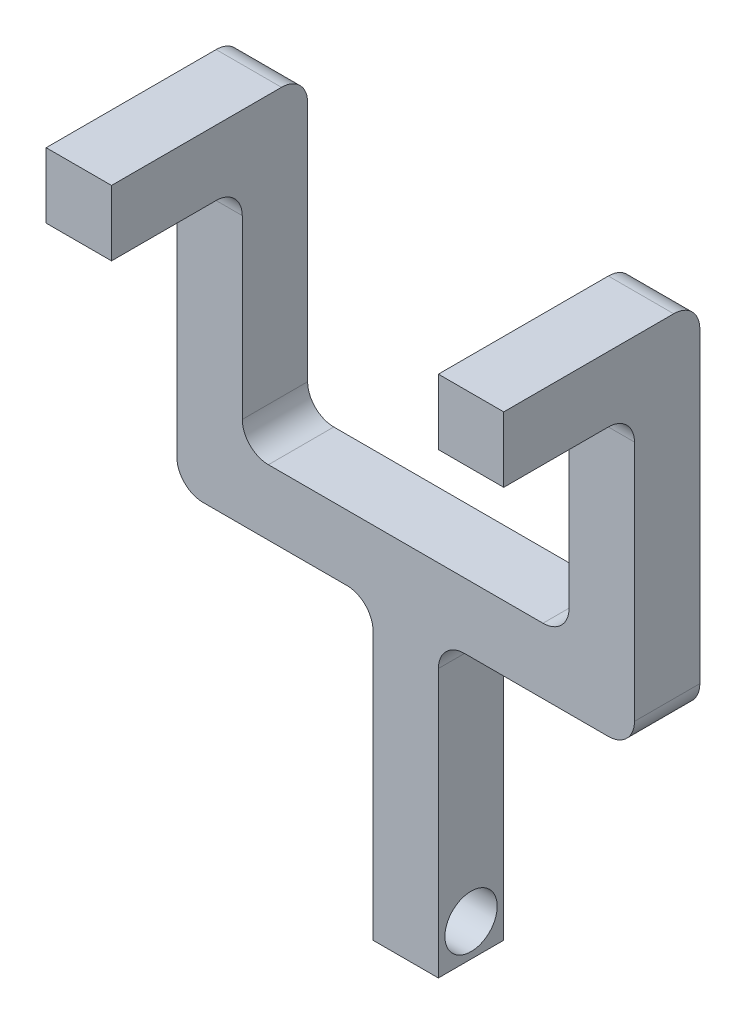
ISO-10303-21;
HEADER;
FILE_DESCRIPTION(('STEP AP214'),'2;1');
FILE_NAME('part.step','',(''),(''),'','','');
FILE_SCHEMA(('AUTOMOTIVE_DESIGN { 1 0 10303 214 1 1 1 1 }'));
ENDSEC;
DATA;
#1=APPLICATION_CONTEXT('core data for automotive mechanical design processes');
#2=APPLICATION_PROTOCOL_DEFINITION('international standard','automotive_design',2000,#1);
#3=PRODUCT_CONTEXT('',#1,'mechanical');
#4=PRODUCT('Part','Part','',(#3));
#5=PRODUCT_RELATED_PRODUCT_CATEGORY('part','',(#4));
#6=PRODUCT_DEFINITION_FORMATION('','',#4);
#7=PRODUCT_DEFINITION_CONTEXT('part definition',#1,'design');
#8=PRODUCT_DEFINITION('design','',#6,#7);
#9=PRODUCT_DEFINITION_SHAPE('','',#8);
#10=(LENGTH_UNIT() NAMED_UNIT(*) SI_UNIT(.MILLI.,.METRE.));
#11=(NAMED_UNIT(*) PLANE_ANGLE_UNIT() SI_UNIT($,.RADIAN.));
#12=(NAMED_UNIT(*) SI_UNIT($,.STERADIAN.) SOLID_ANGLE_UNIT());
#13=UNCERTAINTY_MEASURE_WITH_UNIT(LENGTH_MEASURE(1.E-05),#10,'distance_accuracy_value','');
#14=(GEOMETRIC_REPRESENTATION_CONTEXT(3) GLOBAL_UNCERTAINTY_ASSIGNED_CONTEXT((#13)) GLOBAL_UNIT_ASSIGNED_CONTEXT((#10,
#11,#12)) REPRESENTATION_CONTEXT('',''));
#15=CARTESIAN_POINT('',(0.,0.,0.));
#16=DIRECTION('',(0.,0.,1.));
#17=DIRECTION('',(1.,0.,0.));
#18=AXIS2_PLACEMENT_3D('',#15,#16,#17);
#19=CARTESIAN_POINT('',(0.,0.,10.));
#20=DIRECTION('',(0.,0.,-1.));
#21=DIRECTION('',(-1.,0.,0.));
#22=AXIS2_PLACEMENT_3D('',#19,#20,#21);
#23=PLANE('',#22);
#24=DIRECTION('',(0.,1.,0.));
#25=VECTOR('',#24,1.);
#26=CARTESIAN_POINT('',(70.,100.,10.));
#27=LINE('',#26,#25);
#28=CARTESIAN_POINT('',(70.,49.,10.));
#29=VERTEX_POINT('',#28);
#30=CARTESIAN_POINT('',(70.,86.,10.));
#31=VERTEX_POINT('',#30);
#32=EDGE_CURVE('E267',#29,#31,#27,.T.);
#33=ORIENTED_EDGE('',*,*,#32,.T.);
#34=DIRECTION('',(1.,0.,0.));
#35=VECTOR('',#34,1.);
#36=CARTESIAN_POINT('',(60.,86.,10.));
#37=LINE('',#36,#35);
#38=CARTESIAN_POINT('',(60.,86.,10.));
#39=VERTEX_POINT('',#38);
#40=EDGE_CURVE('E341',#31,#39,#37,.F.);
#41=ORIENTED_EDGE('',*,*,#40,.T.);
#42=DIRECTION('',(0.,-1.,0.));
#43=VECTOR('',#42,1.);
#44=CARTESIAN_POINT('',(60.,55.,10.));
#45=LINE('',#44,#43);
#46=CARTESIAN_POINT('',(60.,59.,10.));
#47=VERTEX_POINT('',#46);
#48=EDGE_CURVE('E270',#39,#47,#45,.T.);
#49=ORIENTED_EDGE('',*,*,#48,.T.);
#50=CARTESIAN_POINT('',(56.,59.,10.));
#51=DIRECTION('',(0.,0.,-1.));
#52=DIRECTION('',(-1.,0.,0.));
#53=AXIS2_PLACEMENT_3D('',#50,#51,#52);
#54=CIRCLE('',#53,4.);
#55=CARTESIAN_POINT('',(56.,55.,10.));
#56=VERTEX_POINT('',#55);
#57=EDGE_CURVE('E407',#47,#56,#54,.T.);
#58=ORIENTED_EDGE('',*,*,#57,.T.);
#59=DIRECTION('',(-1.,0.,0.));
#60=VECTOR('',#59,1.);
#61=CARTESIAN_POINT('',(10.,55.,10.));
#62=LINE('',#61,#60);
#63=CARTESIAN_POINT('',(14.,55.,10.));
#64=VERTEX_POINT('',#63);
#65=EDGE_CURVE('E274',#56,#64,#62,.T.);
#66=ORIENTED_EDGE('',*,*,#65,.T.);
#67=CARTESIAN_POINT('',(14.,59.,10.));
#68=DIRECTION('',(0.,0.,-1.));
#69=DIRECTION('',(-1.,0.,0.));
#70=AXIS2_PLACEMENT_3D('',#67,#68,#69);
#71=CIRCLE('',#70,4.);
#72=CARTESIAN_POINT('',(10.,59.,10.));
#73=VERTEX_POINT('',#72);
#74=EDGE_CURVE('E411',#64,#73,#71,.T.);
#75=ORIENTED_EDGE('',*,*,#74,.T.);
#76=DIRECTION('',(0.,1.,0.));
#77=VECTOR('',#76,1.);
#78=CARTESIAN_POINT('',(10.,100.,10.));
#79=LINE('',#78,#77);
#80=CARTESIAN_POINT('',(10.,86.,10.));
#81=VERTEX_POINT('',#80);
#82=EDGE_CURVE('E277',#73,#81,#79,.T.);
#83=ORIENTED_EDGE('',*,*,#82,.T.);
#84=DIRECTION('',(1.,0.,0.));
#85=VECTOR('',#84,1.);
#86=CARTESIAN_POINT('',(0.,86.,10.));
#87=LINE('',#86,#85);
#88=CARTESIAN_POINT('',(0.,86.,10.));
#89=VERTEX_POINT('',#88);
#90=EDGE_CURVE('E339',#81,#89,#87,.F.);
#91=ORIENTED_EDGE('',*,*,#90,.T.);
#92=DIRECTION('',(0.,-1.,0.));
#93=VECTOR('',#92,1.);
#94=CARTESIAN_POINT('',(0.,45.,10.));
#95=LINE('',#94,#93);
#96=CARTESIAN_POINT('',(0.,49.,10.));
#97=VERTEX_POINT('',#96);
#98=EDGE_CURVE('E280',#89,#97,#95,.T.);
#99=ORIENTED_EDGE('',*,*,#98,.T.);
#100=CARTESIAN_POINT('',(4.,49.,10.));
#101=DIRECTION('',(0.,0.,-1.));
#102=DIRECTION('',(-1.,0.,0.));
#103=AXIS2_PLACEMENT_3D('',#100,#101,#102);
#104=CIRCLE('',#103,4.);
#105=CARTESIAN_POINT('',(4.00000000000001,45.,10.));
#106=VERTEX_POINT('',#105);
#107=EDGE_CURVE('E335',#97,#106,#104,.F.);
#108=ORIENTED_EDGE('',*,*,#107,.T.);
#109=DIRECTION('',(1.,0.,0.));
#110=VECTOR('',#109,1.);
#111=CARTESIAN_POINT('',(30.,45.,10.));
#112=LINE('',#111,#110);
#113=CARTESIAN_POINT('',(26.,45.,10.));
#114=VERTEX_POINT('',#113);
#115=EDGE_CURVE('E283',#106,#114,#112,.T.);
#116=ORIENTED_EDGE('',*,*,#115,.T.);
#117=CARTESIAN_POINT('',(26.,41.,10.));
#118=DIRECTION('',(0.,0.,-1.));
#119=DIRECTION('',(-1.,0.,0.));
#120=AXIS2_PLACEMENT_3D('',#117,#118,#119);
#121=CIRCLE('',#120,4.);
#122=CARTESIAN_POINT('',(30.,41.,10.));
#123=VERTEX_POINT('',#122);
#124=EDGE_CURVE('E11',#114,#123,#121,.T.);
#125=ORIENTED_EDGE('',*,*,#124,.T.);
#126=DIRECTION('',(0.,-1.,0.));
#127=VECTOR('',#126,1.);
#128=CARTESIAN_POINT('',(30.,0.,10.));
#129=LINE('',#128,#127);
#130=CARTESIAN_POINT('',(30.,0.,10.));
#131=VERTEX_POINT('',#130);
#132=EDGE_CURVE('E286',#123,#131,#129,.T.);
#133=ORIENTED_EDGE('',*,*,#132,.T.);
#134=DIRECTION('',(1.,0.,0.));
#135=VECTOR('',#134,1.);
#136=CARTESIAN_POINT('',(40.,0.,10.));
#137=LINE('',#136,#135);
#138=CARTESIAN_POINT('',(40.,0.,10.));
#139=VERTEX_POINT('',#138);
#140=EDGE_CURVE('E288',#131,#139,#137,.T.);
#141=ORIENTED_EDGE('',*,*,#140,.T.);
#142=DIRECTION('',(0.,1.,0.));
#143=VECTOR('',#142,1.);
#144=CARTESIAN_POINT('',(40.,45.,10.));
#145=LINE('',#144,#143);
#146=CARTESIAN_POINT('',(40.,41.,10.));
#147=VERTEX_POINT('',#146);
#148=EDGE_CURVE('E290',#139,#147,#145,.T.);
#149=ORIENTED_EDGE('',*,*,#148,.T.);
#150=CARTESIAN_POINT('',(44.,41.,10.));
#151=DIRECTION('',(0.,0.,-1.));
#152=DIRECTION('',(-1.,0.,0.));
#153=AXIS2_PLACEMENT_3D('',#150,#151,#152);
#154=CIRCLE('',#153,4.);
#155=CARTESIAN_POINT('',(44.,45.,10.));
#156=VERTEX_POINT('',#155);
#157=EDGE_CURVE('E403',#147,#156,#154,.T.);
#158=ORIENTED_EDGE('',*,*,#157,.T.);
#159=DIRECTION('',(1.,0.,0.));
#160=VECTOR('',#159,1.);
#161=CARTESIAN_POINT('',(70.,45.,10.));
#162=LINE('',#161,#160);
#163=CARTESIAN_POINT('',(66.,45.,10.));
#164=VERTEX_POINT('',#163);
#165=EDGE_CURVE('E293',#156,#164,#162,.T.);
#166=ORIENTED_EDGE('',*,*,#165,.T.);
#167=CARTESIAN_POINT('',(66.,49.,10.));
#168=DIRECTION('',(0.,0.,-1.));
#169=DIRECTION('',(-1.,0.,0.));
#170=AXIS2_PLACEMENT_3D('',#167,#168,#169);
#171=CIRCLE('',#170,4.);
#172=EDGE_CURVE('E337',#164,#29,#171,.F.);
#173=ORIENTED_EDGE('',*,*,#172,.T.);
#174=EDGE_LOOP('',(#33,#41,#49,#58,#66,#75,#83,#91,#99,#108,#116,#125,#133,#141,#149,#158,#166,#173));
#175=FACE_BOUND('',#174,.T.);
#176=ADVANCED_FACE('F37',(#175),#23,.F.);
#177=CARTESIAN_POINT('',(70.,100.,10.));
#178=DIRECTION('',(-1.,0.,0.));
#179=DIRECTION('',(0.,0.,1.));
#180=AXIS2_PLACEMENT_3D('',#177,#178,#179);
#181=PLANE('',#180);
#182=ORIENTED_EDGE('',*,*,#32,.F.);
#183=DIRECTION('',(0.,0.,-1.));
#184=VECTOR('',#183,1.);
#185=CARTESIAN_POINT('',(70.,49.,10.));
#186=LINE('',#185,#184);
#187=CARTESIAN_POINT('',(70.,49.,0.));
#188=VERTEX_POINT('',#187);
#189=EDGE_CURVE('E348',#29,#188,#186,.T.);
#190=ORIENTED_EDGE('',*,*,#189,.T.);
#191=DIRECTION('',(0.,1.,0.));
#192=VECTOR('',#191,1.);
#193=CARTESIAN_POINT('',(70.,100.,0.));
#194=LINE('',#193,#192);
#195=CARTESIAN_POINT('',(70.,96.,0.));
#196=VERTEX_POINT('',#195);
#197=EDGE_CURVE('E266',#188,#196,#194,.T.);
#198=ORIENTED_EDGE('',*,*,#197,.T.);
#199=CARTESIAN_POINT('',(70.,96.,4.));
#200=DIRECTION('',(-1.,0.,0.));
#201=DIRECTION('',(0.,0.,1.));
#202=AXIS2_PLACEMENT_3D('',#199,#200,#201);
#203=CIRCLE('',#202,4.);
#204=CARTESIAN_POINT('',(70.,100.,4.));
#205=VERTEX_POINT('',#204);
#206=EDGE_CURVE('E346',#196,#205,#203,.F.);
#207=ORIENTED_EDGE('',*,*,#206,.T.);
#208=DIRECTION('',(0.,0.,-1.));
#209=VECTOR('',#208,1.);
#210=CARTESIAN_POINT('',(70.,100.,10.));
#211=LINE('',#210,#209);
#212=CARTESIAN_POINT('',(70.,100.,30.));
#213=VERTEX_POINT('',#212);
#214=EDGE_CURVE('E221',#213,#205,#211,.T.);
#215=ORIENTED_EDGE('',*,*,#214,.F.);
#216=DIRECTION('',(0.,1.,0.));
#217=VECTOR('',#216,1.);
#218=CARTESIAN_POINT('',(70.,90.,30.));
#219=LINE('',#218,#217);
#220=CARTESIAN_POINT('',(70.,90.,30.));
#221=VERTEX_POINT('',#220);
#222=EDGE_CURVE('E236',#221,#213,#219,.T.);
#223=ORIENTED_EDGE('',*,*,#222,.F.);
#224=DIRECTION('',(0.,0.,-1.));
#225=VECTOR('',#224,1.);
#226=CARTESIAN_POINT('',(70.,90.,30.));
#227=LINE('',#226,#225);
#228=CARTESIAN_POINT('',(70.,90.,14.));
#229=VERTEX_POINT('',#228);
#230=EDGE_CURVE('E246',#221,#229,#227,.T.);
#231=ORIENTED_EDGE('',*,*,#230,.T.);
#232=CARTESIAN_POINT('',(70.,86.,14.));
#233=DIRECTION('',(-1.,0.,0.));
#234=DIRECTION('',(0.,0.,1.));
#235=AXIS2_PLACEMENT_3D('',#232,#233,#234);
#236=CIRCLE('',#235,4.);
#237=EDGE_CURVE('E393',#229,#31,#236,.T.);
#238=ORIENTED_EDGE('',*,*,#237,.T.);
#239=EDGE_LOOP('',(#182,#190,#198,#207,#215,#223,#231,#238));
#240=FACE_BOUND('',#239,.T.);
#241=ADVANCED_FACE('F454',(#240),#181,.F.);
#242=CARTESIAN_POINT('',(60.,100.,10.));
#243=DIRECTION('',(0.,-1.,0.));
#244=DIRECTION('',(0.,0.,-1.));
#245=AXIS2_PLACEMENT_3D('',#242,#243,#244);
#246=PLANE('',#245);
#247=ORIENTED_EDGE('',*,*,#214,.T.);
#248=DIRECTION('',(-1.,0.,0.));
#249=VECTOR('',#248,1.);
#250=CARTESIAN_POINT('',(60.,100.,4.));
#251=LINE('',#250,#249);
#252=CARTESIAN_POINT('',(60.,100.,4.));
#253=VERTEX_POINT('',#252);
#254=EDGE_CURVE('E219',#205,#253,#251,.T.);
#255=ORIENTED_EDGE('',*,*,#254,.T.);
#256=DIRECTION('',(0.,0.,-1.));
#257=VECTOR('',#256,1.);
#258=CARTESIAN_POINT('',(60.,100.,10.));
#259=LINE('',#258,#257);
#260=CARTESIAN_POINT('',(60.,100.,30.));
#261=VERTEX_POINT('',#260);
#262=EDGE_CURVE('E212',#261,#253,#259,.T.);
#263=ORIENTED_EDGE('',*,*,#262,.F.);
#264=DIRECTION('',(-1.,0.,0.));
#265=VECTOR('',#264,1.);
#266=CARTESIAN_POINT('',(70.,100.,30.));
#267=LINE('',#266,#265);
#268=EDGE_CURVE('E217',#213,#261,#267,.T.);
#269=ORIENTED_EDGE('',*,*,#268,.F.);
#270=EDGE_LOOP('',(#247,#255,#263,#269));
#271=FACE_BOUND('',#270,.T.);
#272=ADVANCED_FACE('F215',(#271),#246,.F.);
#273=CARTESIAN_POINT('',(60.,55.,10.));
#274=DIRECTION('',(1.,0.,0.));
#275=DIRECTION('',(0.,0.,-1.));
#276=AXIS2_PLACEMENT_3D('',#273,#274,#275);
#277=PLANE('',#276);
#278=ORIENTED_EDGE('',*,*,#262,.T.);
#279=CARTESIAN_POINT('',(60.,96.,4.));
#280=DIRECTION('',(1.,0.,0.));
#281=DIRECTION('',(0.,0.,-1.));
#282=AXIS2_PLACEMENT_3D('',#279,#280,#281);
#283=CIRCLE('',#282,4.);
#284=CARTESIAN_POINT('',(60.,96.,0.));
#285=VERTEX_POINT('',#284);
#286=EDGE_CURVE('E369',#253,#285,#283,.F.);
#287=ORIENTED_EDGE('',*,*,#286,.T.);
#288=DIRECTION('',(0.,-1.,0.));
#289=VECTOR('',#288,1.);
#290=CARTESIAN_POINT('',(60.,55.,0.));
#291=LINE('',#290,#289);
#292=CARTESIAN_POINT('',(60.,59.,0.));
#293=VERTEX_POINT('',#292);
#294=EDGE_CURVE('E299',#285,#293,#291,.T.);
#295=ORIENTED_EDGE('',*,*,#294,.T.);
#296=DIRECTION('',(0.,0.,-1.));
#297=VECTOR('',#296,1.);
#298=CARTESIAN_POINT('',(60.,59.,10.));
#299=LINE('',#298,#297);
#300=EDGE_CURVE('E367',#293,#47,#299,.F.);
#301=ORIENTED_EDGE('',*,*,#300,.T.);
#302=ORIENTED_EDGE('',*,*,#48,.F.);
#303=CARTESIAN_POINT('',(60.,86.,14.));
#304=DIRECTION('',(1.,0.,0.));
#305=DIRECTION('',(0.,0.,-1.));
#306=AXIS2_PLACEMENT_3D('',#303,#304,#305);
#307=CIRCLE('',#306,4.);
#308=CARTESIAN_POINT('',(60.,90.,14.));
#309=VERTEX_POINT('',#308);
#310=EDGE_CURVE('E395',#39,#309,#307,.T.);
#311=ORIENTED_EDGE('',*,*,#310,.T.);
#312=DIRECTION('',(0.,0.,-1.));
#313=VECTOR('',#312,1.);
#314=CARTESIAN_POINT('',(60.,90.,30.));
#315=LINE('',#314,#313);
#316=CARTESIAN_POINT('',(60.,90.,30.));
#317=VERTEX_POINT('',#316);
#318=EDGE_CURVE('E228',#317,#309,#315,.T.);
#319=ORIENTED_EDGE('',*,*,#318,.F.);
#320=DIRECTION('',(0.,-1.,0.));
#321=VECTOR('',#320,1.);
#322=CARTESIAN_POINT('',(60.,100.,30.));
#323=LINE('',#322,#321);
#324=EDGE_CURVE('E225',#261,#317,#323,.T.);
#325=ORIENTED_EDGE('',*,*,#324,.F.);
#326=EDGE_LOOP('',(#278,#287,#295,#301,#302,#311,#319,#325));
#327=FACE_BOUND('',#326,.T.);
#328=ADVANCED_FACE('F226',(#327),#277,.F.);
#329=CARTESIAN_POINT('',(10.,55.,10.));
#330=DIRECTION('',(0.,-1.,0.));
#331=DIRECTION('',(0.,0.,-1.));
#332=AXIS2_PLACEMENT_3D('',#329,#330,#331);
#333=PLANE('',#332);
#334=ORIENTED_EDGE('',*,*,#65,.F.);
#335=DIRECTION('',(0.,0.,-1.));
#336=VECTOR('',#335,1.);
#337=CARTESIAN_POINT('',(56.,55.,0.));
#338=LINE('',#337,#336);
#339=CARTESIAN_POINT('',(56.,55.,0.));
#340=VERTEX_POINT('',#339);
#341=EDGE_CURVE('E373',#56,#340,#338,.T.);
#342=ORIENTED_EDGE('',*,*,#341,.T.);
#343=DIRECTION('',(-1.,0.,0.));
#344=VECTOR('',#343,1.);
#345=CARTESIAN_POINT('',(10.,55.,0.));
#346=LINE('',#345,#344);
#347=CARTESIAN_POINT('',(14.,55.,0.));
#348=VERTEX_POINT('',#347);
#349=EDGE_CURVE('E302',#340,#348,#346,.T.);
#350=ORIENTED_EDGE('',*,*,#349,.T.);
#351=DIRECTION('',(0.,0.,-1.));
#352=VECTOR('',#351,1.);
#353=CARTESIAN_POINT('',(14.,55.,10.));
#354=LINE('',#353,#352);
#355=EDGE_CURVE('E371',#348,#64,#354,.F.);
#356=ORIENTED_EDGE('',*,*,#355,.T.);
#357=EDGE_LOOP('',(#334,#342,#350,#356));
#358=FACE_BOUND('',#357,.T.);
#359=ADVANCED_FACE('F477',(#358),#333,.F.);
#360=CARTESIAN_POINT('',(10.,100.,10.));
#361=DIRECTION('',(-1.,0.,0.));
#362=DIRECTION('',(0.,-1.,0.));
#363=AXIS2_PLACEMENT_3D('',#360,#361,#362);
#364=PLANE('',#363);
#365=ORIENTED_EDGE('',*,*,#82,.F.);
#366=DIRECTION('',(0.,0.,-1.));
#367=VECTOR('',#366,1.);
#368=CARTESIAN_POINT('',(10.,59.,0.));
#369=LINE('',#368,#367);
#370=CARTESIAN_POINT('',(10.,59.,0.));
#371=VERTEX_POINT('',#370);
#372=EDGE_CURVE('E377',#73,#371,#369,.T.);
#373=ORIENTED_EDGE('',*,*,#372,.T.);
#374=DIRECTION('',(0.,1.,0.));
#375=VECTOR('',#374,1.);
#376=CARTESIAN_POINT('',(10.,100.,0.));
#377=LINE('',#376,#375);
#378=CARTESIAN_POINT('',(10.,96.,0.));
#379=VERTEX_POINT('',#378);
#380=EDGE_CURVE('E305',#371,#379,#377,.T.);
#381=ORIENTED_EDGE('',*,*,#380,.T.);
#382=CARTESIAN_POINT('',(10.,96.,4.));
#383=DIRECTION('',(-1.,0.,0.));
#384=DIRECTION('',(0.,-1.,0.));
#385=AXIS2_PLACEMENT_3D('',#382,#383,#384);
#386=CIRCLE('',#385,4.);
#387=CARTESIAN_POINT('',(10.,100.,4.));
#388=VERTEX_POINT('',#387);
#389=EDGE_CURVE('E60',#379,#388,#386,.F.);
#390=ORIENTED_EDGE('',*,*,#389,.T.);
#391=DIRECTION('',(0.,0.,-1.));
#392=VECTOR('',#391,1.);
#393=CARTESIAN_POINT('',(10.,100.,10.));
#394=LINE('',#393,#392);
#395=CARTESIAN_POINT('',(10.,100.,30.));
#396=VERTEX_POINT('',#395);
#397=EDGE_CURVE('E222',#396,#388,#394,.T.);
#398=ORIENTED_EDGE('',*,*,#397,.F.);
#399=DIRECTION('',(0.,1.,0.));
#400=VECTOR('',#399,1.);
#401=CARTESIAN_POINT('',(10.,90.,30.));
#402=LINE('',#401,#400);
#403=CARTESIAN_POINT('',(10.,90.,30.));
#404=VERTEX_POINT('',#403);
#405=EDGE_CURVE('E257',#404,#396,#402,.T.);
#406=ORIENTED_EDGE('',*,*,#405,.F.);
#407=DIRECTION('',(0.,0.,-1.));
#408=VECTOR('',#407,1.);
#409=CARTESIAN_POINT('',(10.,90.,30.));
#410=LINE('',#409,#408);
#411=CARTESIAN_POINT('',(10.,90.,14.));
#412=VERTEX_POINT('',#411);
#413=EDGE_CURVE('E260',#404,#412,#410,.T.);
#414=ORIENTED_EDGE('',*,*,#413,.T.);
#415=CARTESIAN_POINT('',(10.,86.,14.));
#416=DIRECTION('',(-1.,0.,0.));
#417=DIRECTION('',(0.,-1.,0.));
#418=AXIS2_PLACEMENT_3D('',#415,#416,#417);
#419=CIRCLE('',#418,4.);
#420=EDGE_CURVE('E397',#412,#81,#419,.T.);
#421=ORIENTED_EDGE('',*,*,#420,.T.);
#422=EDGE_LOOP('',(#365,#373,#381,#390,#398,#406,#414,#421));
#423=FACE_BOUND('',#422,.T.);
#424=ADVANCED_FACE('F485',(#423),#364,.F.);
#425=CARTESIAN_POINT('',(0.,100.,10.));
#426=DIRECTION('',(0.,-1.,0.));
#427=DIRECTION('',(0.,0.,-1.));
#428=AXIS2_PLACEMENT_3D('',#425,#426,#427);
#429=PLANE('',#428);
#430=ORIENTED_EDGE('',*,*,#397,.T.);
#431=DIRECTION('',(-1.,0.,0.));
#432=VECTOR('',#431,1.);
#433=CARTESIAN_POINT('',(0.,100.,4.));
#434=LINE('',#433,#432);
#435=CARTESIAN_POINT('',(0.,100.,4.));
#436=VERTEX_POINT('',#435);
#437=EDGE_CURVE('E380',#388,#436,#434,.T.);
#438=ORIENTED_EDGE('',*,*,#437,.T.);
#439=DIRECTION('',(0.,0.,-1.));
#440=VECTOR('',#439,1.);
#441=CARTESIAN_POINT('',(0.,100.,10.));
#442=LINE('',#441,#440);
#443=CARTESIAN_POINT('',(0.,100.,30.));
#444=VERTEX_POINT('',#443);
#445=EDGE_CURVE('E327',#444,#436,#442,.T.);
#446=ORIENTED_EDGE('',*,*,#445,.F.);
#447=DIRECTION('',(-1.,0.,0.));
#448=VECTOR('',#447,1.);
#449=CARTESIAN_POINT('',(10.,100.,30.));
#450=LINE('',#449,#448);
#451=EDGE_CURVE('E250',#396,#444,#450,.T.);
#452=ORIENTED_EDGE('',*,*,#451,.F.);
#453=EDGE_LOOP('',(#430,#438,#446,#452));
#454=FACE_BOUND('',#453,.T.);
#455=ADVANCED_FACE('F489',(#454),#429,.F.);
#456=CARTESIAN_POINT('',(0.,45.,10.));
#457=DIRECTION('',(1.,0.,0.));
#458=DIRECTION('',(0.,0.,-1.));
#459=AXIS2_PLACEMENT_3D('',#456,#457,#458);
#460=PLANE('',#459);
#461=ORIENTED_EDGE('',*,*,#445,.T.);
#462=CARTESIAN_POINT('',(0.,96.,4.));
#463=DIRECTION('',(1.,0.,0.));
#464=DIRECTION('',(0.,0.,-1.));
#465=AXIS2_PLACEMENT_3D('',#462,#463,#464);
#466=CIRCLE('',#465,4.);
#467=CARTESIAN_POINT('',(0.,96.,0.));
#468=VERTEX_POINT('',#467);
#469=EDGE_CURVE('E52',#436,#468,#466,.F.);
#470=ORIENTED_EDGE('',*,*,#469,.T.);
#471=DIRECTION('',(0.,-1.,0.));
#472=VECTOR('',#471,1.);
#473=CARTESIAN_POINT('',(0.,45.,0.));
#474=LINE('',#473,#472);
#475=CARTESIAN_POINT('',(0.,49.,0.));
#476=VERTEX_POINT('',#475);
#477=EDGE_CURVE('E307',#468,#476,#474,.T.);
#478=ORIENTED_EDGE('',*,*,#477,.T.);
#479=DIRECTION('',(0.,0.,-1.));
#480=VECTOR('',#479,1.);
#481=CARTESIAN_POINT('',(0.,49.,10.));
#482=LINE('',#481,#480);
#483=EDGE_CURVE('E382',#476,#97,#482,.F.);
#484=ORIENTED_EDGE('',*,*,#483,.T.);
#485=ORIENTED_EDGE('',*,*,#98,.F.);
#486=CARTESIAN_POINT('',(0.,86.,14.));
#487=DIRECTION('',(1.,0.,0.));
#488=DIRECTION('',(0.,0.,-1.));
#489=AXIS2_PLACEMENT_3D('',#486,#487,#488);
#490=CIRCLE('',#489,4.);
#491=CARTESIAN_POINT('',(0.,90.,14.));
#492=VERTEX_POINT('',#491);
#493=EDGE_CURVE('E399',#89,#492,#490,.T.);
#494=ORIENTED_EDGE('',*,*,#493,.T.);
#495=DIRECTION('',(0.,0.,-1.));
#496=VECTOR('',#495,1.);
#497=CARTESIAN_POINT('',(0.,90.,30.));
#498=LINE('',#497,#496);
#499=CARTESIAN_POINT('',(0.,90.,30.));
#500=VERTEX_POINT('',#499);
#501=EDGE_CURVE('E263',#500,#492,#498,.T.);
#502=ORIENTED_EDGE('',*,*,#501,.F.);
#503=DIRECTION('',(0.,-1.,0.));
#504=VECTOR('',#503,1.);
#505=CARTESIAN_POINT('',(0.,100.,30.));
#506=LINE('',#505,#504);
#507=EDGE_CURVE('E253',#444,#500,#506,.T.);
#508=ORIENTED_EDGE('',*,*,#507,.F.);
#509=EDGE_LOOP('',(#461,#470,#478,#484,#485,#494,#502,#508));
#510=FACE_BOUND('',#509,.T.);
#511=ADVANCED_FACE('F493',(#510),#460,.F.);
#512=CARTESIAN_POINT('',(30.,45.,10.));
#513=DIRECTION('',(0.,1.,0.));
#514=DIRECTION('',(0.,0.,1.));
#515=AXIS2_PLACEMENT_3D('',#512,#513,#514);
#516=PLANE('',#515);
#517=ORIENTED_EDGE('',*,*,#115,.F.);
#518=DIRECTION('',(0.,0.,-1.));
#519=VECTOR('',#518,1.);
#520=CARTESIAN_POINT('',(4.,45.,10.));
#521=LINE('',#520,#519);
#522=CARTESIAN_POINT('',(4.00000000000001,45.,0.));
#523=VERTEX_POINT('',#522);
#524=EDGE_CURVE('E387',#106,#523,#521,.T.);
#525=ORIENTED_EDGE('',*,*,#524,.T.);
#526=DIRECTION('',(1.,0.,0.));
#527=VECTOR('',#526,1.);
#528=CARTESIAN_POINT('',(30.,45.,0.));
#529=LINE('',#528,#527);
#530=CARTESIAN_POINT('',(26.,45.,0.));
#531=VERTEX_POINT('',#530);
#532=EDGE_CURVE('E310',#523,#531,#529,.T.);
#533=ORIENTED_EDGE('',*,*,#532,.T.);
#534=DIRECTION('',(0.,0.,-1.));
#535=VECTOR('',#534,1.);
#536=CARTESIAN_POINT('',(26.,45.,10.));
#537=LINE('',#536,#535);
#538=EDGE_CURVE('E385',#531,#114,#537,.F.);
#539=ORIENTED_EDGE('',*,*,#538,.T.);
#540=EDGE_LOOP('',(#517,#525,#533,#539));
#541=FACE_BOUND('',#540,.T.);
#542=ADVANCED_FACE('F423',(#541),#516,.F.);
#543=CARTESIAN_POINT('',(30.,0.,10.));
#544=DIRECTION('',(1.,0.,0.));
#545=DIRECTION('',(0.,0.,-1.));
#546=AXIS2_PLACEMENT_3D('',#543,#544,#545);
#547=PLANE('',#546);
#548=CARTESIAN_POINT('',(30.,5.,5.));
#549=DIRECTION('',(-1.,0.,0.));
#550=DIRECTION('',(0.,0.,1.));
#551=AXIS2_PLACEMENT_3D('',#548,#549,#550);
#552=CIRCLE('',#551,4.);
#553=CARTESIAN_POINT('',(30.,5.,9.));
#554=VERTEX_POINT('',#553);
#555=EDGE_CURVE('E240',#554,#554,#552,.T.);
#556=ORIENTED_EDGE('',*,*,#555,.F.);
#557=EDGE_LOOP('',(#556));
#558=FACE_BOUND('',#557,.T.);
#559=ORIENTED_EDGE('',*,*,#132,.F.);
#560=DIRECTION('',(0.,0.,-1.));
#561=VECTOR('',#560,1.);
#562=CARTESIAN_POINT('',(30.,41.,0.));
#563=LINE('',#562,#561);
#564=CARTESIAN_POINT('',(30.,41.,0.));
#565=VERTEX_POINT('',#564);
#566=EDGE_CURVE('E390',#123,#565,#563,.T.);
#567=ORIENTED_EDGE('',*,*,#566,.T.);
#568=DIRECTION('',(0.,-1.,0.));
#569=VECTOR('',#568,1.);
#570=CARTESIAN_POINT('',(30.,0.,0.));
#571=LINE('',#570,#569);
#572=CARTESIAN_POINT('',(30.,0.,0.));
#573=VERTEX_POINT('',#572);
#574=EDGE_CURVE('E313',#565,#573,#571,.T.);
#575=ORIENTED_EDGE('',*,*,#574,.T.);
#576=DIRECTION('',(0.,0.,-1.));
#577=VECTOR('',#576,1.);
#578=CARTESIAN_POINT('',(30.,0.,10.));
#579=LINE('',#578,#577);
#580=EDGE_CURVE('E324',#131,#573,#579,.T.);
#581=ORIENTED_EDGE('',*,*,#580,.F.);
#582=EDGE_LOOP('',(#559,#567,#575,#581));
#583=FACE_BOUND('',#582,.T.);
#584=ADVANCED_FACE('F430',(#558,#583),#547,.F.);
#585=CARTESIAN_POINT('',(40.,0.,10.));
#586=DIRECTION('',(0.,1.,0.));
#587=DIRECTION('',(0.,0.,1.));
#588=AXIS2_PLACEMENT_3D('',#585,#586,#587);
#589=PLANE('',#588);
#590=DIRECTION('',(1.,0.,0.));
#591=VECTOR('',#590,1.);
#592=CARTESIAN_POINT('',(40.,0.,0.));
#593=LINE('',#592,#591);
#594=CARTESIAN_POINT('',(40.,0.,0.));
#595=VERTEX_POINT('',#594);
#596=EDGE_CURVE('E315',#573,#595,#593,.T.);
#597=ORIENTED_EDGE('',*,*,#596,.T.);
#598=DIRECTION('',(0.,0.,-1.));
#599=VECTOR('',#598,1.);
#600=CARTESIAN_POINT('',(40.,0.,10.));
#601=LINE('',#600,#599);
#602=EDGE_CURVE('E296',#139,#595,#601,.T.);
#603=ORIENTED_EDGE('',*,*,#602,.F.);
#604=ORIENTED_EDGE('',*,*,#140,.F.);
#605=ORIENTED_EDGE('',*,*,#580,.T.);
#606=EDGE_LOOP('',(#597,#603,#604,#605));
#607=FACE_BOUND('',#606,.T.);
#608=ADVANCED_FACE('F434',(#607),#589,.F.);
#609=CARTESIAN_POINT('',(40.,45.,10.));
#610=DIRECTION('',(-1.,0.,0.));
#611=DIRECTION('',(0.,0.,1.));
#612=AXIS2_PLACEMENT_3D('',#609,#610,#611);
#613=PLANE('',#612);
#614=CARTESIAN_POINT('',(40.,5.,5.));
#615=DIRECTION('',(-1.,0.,0.));
#616=DIRECTION('',(0.,0.,1.));
#617=AXIS2_PLACEMENT_3D('',#614,#615,#616);
#618=CIRCLE('',#617,4.);
#619=CARTESIAN_POINT('',(40.,5.,9.));
#620=VERTEX_POINT('',#619);
#621=EDGE_CURVE('E237',#620,#620,#618,.F.);
#622=ORIENTED_EDGE('',*,*,#621,.F.);
#623=EDGE_LOOP('',(#622));
#624=FACE_BOUND('',#623,.T.);
#625=DIRECTION('',(0.,1.,0.));
#626=VECTOR('',#625,1.);
#627=CARTESIAN_POINT('',(40.,45.,0.));
#628=LINE('',#627,#626);
#629=CARTESIAN_POINT('',(40.,41.,0.));
#630=VERTEX_POINT('',#629);
#631=EDGE_CURVE('E317',#595,#630,#628,.T.);
#632=ORIENTED_EDGE('',*,*,#631,.T.);
#633=DIRECTION('',(0.,0.,-1.));
#634=VECTOR('',#633,1.);
#635=CARTESIAN_POINT('',(40.,41.,10.));
#636=LINE('',#635,#634);
#637=EDGE_CURVE('E364',#630,#147,#636,.F.);
#638=ORIENTED_EDGE('',*,*,#637,.T.);
#639=ORIENTED_EDGE('',*,*,#148,.F.);
#640=ORIENTED_EDGE('',*,*,#602,.T.);
#641=EDGE_LOOP('',(#632,#638,#639,#640));
#642=FACE_BOUND('',#641,.T.);
#643=ADVANCED_FACE('F531',(#624,#642),#613,.F.);
#644=CARTESIAN_POINT('',(70.,45.,10.));
#645=DIRECTION('',(0.,1.,0.));
#646=DIRECTION('',(0.,0.,1.));
#647=AXIS2_PLACEMENT_3D('',#644,#645,#646);
#648=PLANE('',#647);
#649=DIRECTION('',(1.,0.,0.));
#650=VECTOR('',#649,1.);
#651=CARTESIAN_POINT('',(70.,45.,0.));
#652=LINE('',#651,#650);
#653=CARTESIAN_POINT('',(44.,45.,0.));
#654=VERTEX_POINT('',#653);
#655=CARTESIAN_POINT('',(66.,45.,0.));
#656=VERTEX_POINT('',#655);
#657=EDGE_CURVE('E271',#654,#656,#652,.T.);
#658=ORIENTED_EDGE('',*,*,#657,.T.);
#659=DIRECTION('',(0.,0.,-1.));
#660=VECTOR('',#659,1.);
#661=CARTESIAN_POINT('',(66.,45.,10.));
#662=LINE('',#661,#660);
#663=EDGE_CURVE('E362',#656,#164,#662,.F.);
#664=ORIENTED_EDGE('',*,*,#663,.T.);
#665=ORIENTED_EDGE('',*,*,#165,.F.);
#666=DIRECTION('',(0.,0.,-1.));
#667=VECTOR('',#666,1.);
#668=CARTESIAN_POINT('',(44.,45.,0.));
#669=LINE('',#668,#667);
#670=EDGE_CURVE('E359',#156,#654,#669,.T.);
#671=ORIENTED_EDGE('',*,*,#670,.T.);
#672=EDGE_LOOP('',(#658,#664,#665,#671));
#673=FACE_BOUND('',#672,.T.);
#674=ADVANCED_FACE('F445',(#673),#648,.F.);
#675=CARTESIAN_POINT('',(0.,0.,0.));
#676=DIRECTION('',(0.,0.,-1.));
#677=DIRECTION('',(-1.,0.,0.));
#678=AXIS2_PLACEMENT_3D('',#675,#676,#677);
#679=PLANE('',#678);
#680=ORIENTED_EDGE('',*,*,#197,.F.);
#681=CARTESIAN_POINT('',(66.,49.,0.));
#682=DIRECTION('',(0.,0.,-1.));
#683=DIRECTION('',(-1.,0.,0.));
#684=AXIS2_PLACEMENT_3D('',#681,#682,#683);
#685=CIRCLE('',#684,4.);
#686=EDGE_CURVE('E357',#188,#656,#685,.T.);
#687=ORIENTED_EDGE('',*,*,#686,.T.);
#688=ORIENTED_EDGE('',*,*,#657,.F.);
#689=CARTESIAN_POINT('',(44.,41.,0.));
#690=DIRECTION('',(0.,0.,-1.));
#691=DIRECTION('',(-1.,0.,0.));
#692=AXIS2_PLACEMENT_3D('',#689,#690,#691);
#693=CIRCLE('',#692,4.);
#694=EDGE_CURVE('E401',#654,#630,#693,.F.);
#695=ORIENTED_EDGE('',*,*,#694,.T.);
#696=ORIENTED_EDGE('',*,*,#631,.F.);
#697=ORIENTED_EDGE('',*,*,#596,.F.);
#698=ORIENTED_EDGE('',*,*,#574,.F.);
#699=CARTESIAN_POINT('',(26.,41.,0.));
#700=DIRECTION('',(0.,0.,-1.));
#701=DIRECTION('',(-1.,0.,0.));
#702=AXIS2_PLACEMENT_3D('',#699,#700,#701);
#703=CIRCLE('',#702,4.);
#704=EDGE_CURVE('E45',#565,#531,#703,.F.);
#705=ORIENTED_EDGE('',*,*,#704,.T.);
#706=ORIENTED_EDGE('',*,*,#532,.F.);
#707=CARTESIAN_POINT('',(4.,49.,0.));
#708=DIRECTION('',(0.,0.,-1.));
#709=DIRECTION('',(-1.,0.,0.));
#710=AXIS2_PLACEMENT_3D('',#707,#708,#709);
#711=CIRCLE('',#710,4.);
#712=EDGE_CURVE('E351',#523,#476,#711,.T.);
#713=ORIENTED_EDGE('',*,*,#712,.T.);
#714=ORIENTED_EDGE('',*,*,#477,.F.);
#715=DIRECTION('',(-1.,0.,0.));
#716=VECTOR('',#715,1.);
#717=CARTESIAN_POINT('',(10.,96.,0.));
#718=LINE('',#717,#716);
#719=EDGE_CURVE('E353',#468,#379,#718,.F.);
#720=ORIENTED_EDGE('',*,*,#719,.T.);
#721=ORIENTED_EDGE('',*,*,#380,.F.);
#722=CARTESIAN_POINT('',(14.,59.,0.));
#723=DIRECTION('',(0.,0.,-1.));
#724=DIRECTION('',(-1.,0.,0.));
#725=AXIS2_PLACEMENT_3D('',#722,#723,#724);
#726=CIRCLE('',#725,4.);
#727=EDGE_CURVE('E409',#371,#348,#726,.F.);
#728=ORIENTED_EDGE('',*,*,#727,.T.);
#729=ORIENTED_EDGE('',*,*,#349,.F.);
#730=CARTESIAN_POINT('',(56.,59.,0.));
#731=DIRECTION('',(0.,0.,-1.));
#732=DIRECTION('',(-1.,0.,0.));
#733=AXIS2_PLACEMENT_3D('',#730,#731,#732);
#734=CIRCLE('',#733,4.);
#735=EDGE_CURVE('E405',#340,#293,#734,.F.);
#736=ORIENTED_EDGE('',*,*,#735,.T.);
#737=ORIENTED_EDGE('',*,*,#294,.F.);
#738=DIRECTION('',(-1.,0.,0.));
#739=VECTOR('',#738,1.);
#740=CARTESIAN_POINT('',(70.,96.,0.));
#741=LINE('',#740,#739);
#742=EDGE_CURVE('E355',#285,#196,#741,.F.);
#743=ORIENTED_EDGE('',*,*,#742,.T.);
#744=EDGE_LOOP('',(#680,#687,#688,#695,#696,#697,#698,#705,#706,#713,#714,#720,#721,#728,#729,
#736,#737,#743));
#745=FACE_BOUND('',#744,.T.);
#746=ADVANCED_FACE('F416',(#745),#679,.T.);
#747=CARTESIAN_POINT('',(0.,90.,30.));
#748=DIRECTION('',(0.,1.,0.));
#749=DIRECTION('',(-1.,0.,0.));
#750=AXIS2_PLACEMENT_3D('',#747,#748,#749);
#751=PLANE('',#750);
#752=ORIENTED_EDGE('',*,*,#501,.T.);
#753=DIRECTION('',(1.,0.,0.));
#754=VECTOR('',#753,1.);
#755=CARTESIAN_POINT('',(10.,90.,14.));
#756=LINE('',#755,#754);
#757=EDGE_CURVE('E343',#492,#412,#756,.T.);
#758=ORIENTED_EDGE('',*,*,#757,.T.);
#759=ORIENTED_EDGE('',*,*,#413,.F.);
#760=DIRECTION('',(1.,0.,0.));
#761=VECTOR('',#760,1.);
#762=CARTESIAN_POINT('',(0.,90.,30.));
#763=LINE('',#762,#761);
#764=EDGE_CURVE('E255',#500,#404,#763,.T.);
#765=ORIENTED_EDGE('',*,*,#764,.F.);
#766=EDGE_LOOP('',(#752,#758,#759,#765));
#767=FACE_BOUND('',#766,.T.);
#768=ADVANCED_FACE('F501',(#767),#751,.F.);
#769=CARTESIAN_POINT('',(0.,0.,30.));
#770=DIRECTION('',(0.,0.,1.));
#771=DIRECTION('',(1.,0.,0.));
#772=AXIS2_PLACEMENT_3D('',#769,#770,#771);
#773=PLANE('',#772);
#774=ORIENTED_EDGE('',*,*,#451,.T.);
#775=ORIENTED_EDGE('',*,*,#507,.T.);
#776=ORIENTED_EDGE('',*,*,#764,.T.);
#777=ORIENTED_EDGE('',*,*,#405,.T.);
#778=EDGE_LOOP('',(#774,#775,#776,#777));
#779=FACE_BOUND('',#778,.T.);
#780=ADVANCED_FACE('F497',(#779),#773,.T.);
#781=CARTESIAN_POINT('',(60.,90.,30.));
#782=DIRECTION('',(0.,1.,0.));
#783=DIRECTION('',(0.,0.,1.));
#784=AXIS2_PLACEMENT_3D('',#781,#782,#783);
#785=PLANE('',#784);
#786=ORIENTED_EDGE('',*,*,#318,.T.);
#787=DIRECTION('',(1.,0.,0.));
#788=VECTOR('',#787,1.);
#789=CARTESIAN_POINT('',(70.,90.,14.));
#790=LINE('',#789,#788);
#791=EDGE_CURVE('E332',#309,#229,#790,.T.);
#792=ORIENTED_EDGE('',*,*,#791,.T.);
#793=ORIENTED_EDGE('',*,*,#230,.F.);
#794=DIRECTION('',(1.,0.,0.));
#795=VECTOR('',#794,1.);
#796=CARTESIAN_POINT('',(60.,90.,30.));
#797=LINE('',#796,#795);
#798=EDGE_CURVE('E231',#317,#221,#797,.T.);
#799=ORIENTED_EDGE('',*,*,#798,.F.);
#800=EDGE_LOOP('',(#786,#792,#793,#799));
#801=FACE_BOUND('',#800,.T.);
#802=ADVANCED_FACE('F463',(#801),#785,.F.);
#803=CARTESIAN_POINT('',(0.,0.,30.));
#804=DIRECTION('',(0.,0.,1.));
#805=DIRECTION('',(1.,0.,0.));
#806=AXIS2_PLACEMENT_3D('',#803,#804,#805);
#807=PLANE('',#806);
#808=ORIENTED_EDGE('',*,*,#268,.T.);
#809=ORIENTED_EDGE('',*,*,#324,.T.);
#810=ORIENTED_EDGE('',*,*,#798,.T.);
#811=ORIENTED_EDGE('',*,*,#222,.T.);
#812=EDGE_LOOP('',(#808,#809,#810,#811));
#813=FACE_BOUND('',#812,.T.);
#814=ADVANCED_FACE('F234',(#813),#807,.T.);
#815=CARTESIAN_POINT('',(30.,5.,5.));
#816=DIRECTION('',(-1.,0.,0.));
#817=DIRECTION('',(0.,0.,1.));
#818=AXIS2_PLACEMENT_3D('',#815,#816,#817);
#819=CYLINDRICAL_SURFACE('',#818,4.);
#820=ORIENTED_EDGE('',*,*,#621,.T.);
#821=EDGE_LOOP('',(#820));
#822=FACE_BOUND('',#821,.T.);
#823=ORIENTED_EDGE('',*,*,#555,.T.);
#824=EDGE_LOOP('',(#823));
#825=FACE_BOUND('',#824,.T.);
#826=ADVANCED_FACE('F556',(#822,#825),#819,.F.);
#827=CARTESIAN_POINT('',(60.,86.,14.));
#828=DIRECTION('',(-1.,0.,0.));
#829=DIRECTION('',(0.,0.,1.));
#830=AXIS2_PLACEMENT_3D('',#827,#828,#829);
#831=CYLINDRICAL_SURFACE('',#830,4.);
#832=ORIENTED_EDGE('',*,*,#310,.F.);
#833=ORIENTED_EDGE('',*,*,#40,.F.);
#834=ORIENTED_EDGE('',*,*,#237,.F.);
#835=ORIENTED_EDGE('',*,*,#791,.F.);
#836=EDGE_LOOP('',(#832,#833,#834,#835));
#837=FACE_BOUND('',#836,.T.);
#838=ADVANCED_FACE('F460',(#837),#831,.F.);
#839=CARTESIAN_POINT('',(0.,86.,14.));
#840=DIRECTION('',(-1.,0.,0.));
#841=DIRECTION('',(0.,-1.,0.));
#842=AXIS2_PLACEMENT_3D('',#839,#840,#841);
#843=CYLINDRICAL_SURFACE('',#842,4.);
#844=ORIENTED_EDGE('',*,*,#493,.F.);
#845=ORIENTED_EDGE('',*,*,#90,.F.);
#846=ORIENTED_EDGE('',*,*,#420,.F.);
#847=ORIENTED_EDGE('',*,*,#757,.F.);
#848=EDGE_LOOP('',(#844,#845,#846,#847));
#849=FACE_BOUND('',#848,.T.);
#850=ADVANCED_FACE('F505',(#849),#843,.F.);
#851=CARTESIAN_POINT('',(66.,49.,10.));
#852=DIRECTION('',(0.,0.,-1.));
#853=DIRECTION('',(-1.,0.,0.));
#854=AXIS2_PLACEMENT_3D('',#851,#852,#853);
#855=CYLINDRICAL_SURFACE('',#854,4.);
#856=ORIENTED_EDGE('',*,*,#172,.F.);
#857=ORIENTED_EDGE('',*,*,#663,.F.);
#858=ORIENTED_EDGE('',*,*,#686,.F.);
#859=ORIENTED_EDGE('',*,*,#189,.F.);
#860=EDGE_LOOP('',(#856,#857,#858,#859));
#861=FACE_BOUND('',#860,.T.);
#862=ADVANCED_FACE('F451',(#861),#855,.T.);
#863=CARTESIAN_POINT('',(44.,41.,10.));
#864=DIRECTION('',(0.,0.,1.));
#865=DIRECTION('',(1.,0.,0.));
#866=AXIS2_PLACEMENT_3D('',#863,#864,#865);
#867=CYLINDRICAL_SURFACE('',#866,4.);
#868=ORIENTED_EDGE('',*,*,#157,.F.);
#869=ORIENTED_EDGE('',*,*,#637,.F.);
#870=ORIENTED_EDGE('',*,*,#694,.F.);
#871=ORIENTED_EDGE('',*,*,#670,.F.);
#872=EDGE_LOOP('',(#868,#869,#870,#871));
#873=FACE_BOUND('',#872,.T.);
#874=ADVANCED_FACE('F442',(#873),#867,.F.);
#875=CARTESIAN_POINT('',(60.,96.,4.));
#876=DIRECTION('',(1.,0.,0.));
#877=DIRECTION('',(0.,0.,-1.));
#878=AXIS2_PLACEMENT_3D('',#875,#876,#877);
#879=CYLINDRICAL_SURFACE('',#878,4.);
#880=ORIENTED_EDGE('',*,*,#206,.F.);
#881=ORIENTED_EDGE('',*,*,#742,.F.);
#882=ORIENTED_EDGE('',*,*,#286,.F.);
#883=ORIENTED_EDGE('',*,*,#254,.F.);
#884=EDGE_LOOP('',(#880,#881,#882,#883));
#885=FACE_BOUND('',#884,.T.);
#886=ADVANCED_FACE('F466',(#885),#879,.T.);
#887=CARTESIAN_POINT('',(56.,59.,10.));
#888=DIRECTION('',(0.,0.,1.));
#889=DIRECTION('',(1.,0.,0.));
#890=AXIS2_PLACEMENT_3D('',#887,#888,#889);
#891=CYLINDRICAL_SURFACE('',#890,4.);
#892=ORIENTED_EDGE('',*,*,#57,.F.);
#893=ORIENTED_EDGE('',*,*,#300,.F.);
#894=ORIENTED_EDGE('',*,*,#735,.F.);
#895=ORIENTED_EDGE('',*,*,#341,.F.);
#896=EDGE_LOOP('',(#892,#893,#894,#895));
#897=FACE_BOUND('',#896,.T.);
#898=ADVANCED_FACE('F474',(#897),#891,.F.);
#899=CARTESIAN_POINT('',(14.,59.,10.));
#900=DIRECTION('',(0.,0.,1.));
#901=DIRECTION('',(1.,0.,0.));
#902=AXIS2_PLACEMENT_3D('',#899,#900,#901);
#903=CYLINDRICAL_SURFACE('',#902,4.);
#904=ORIENTED_EDGE('',*,*,#74,.F.);
#905=ORIENTED_EDGE('',*,*,#355,.F.);
#906=ORIENTED_EDGE('',*,*,#727,.F.);
#907=ORIENTED_EDGE('',*,*,#372,.F.);
#908=EDGE_LOOP('',(#904,#905,#906,#907));
#909=FACE_BOUND('',#908,.T.);
#910=ADVANCED_FACE('F483',(#909),#903,.F.);
#911=CARTESIAN_POINT('',(0.,96.,4.));
#912=DIRECTION('',(1.,0.,0.));
#913=DIRECTION('',(0.,0.,-1.));
#914=AXIS2_PLACEMENT_3D('',#911,#912,#913);
#915=CYLINDRICAL_SURFACE('',#914,4.);
#916=ORIENTED_EDGE('',*,*,#389,.F.);
#917=ORIENTED_EDGE('',*,*,#719,.F.);
#918=ORIENTED_EDGE('',*,*,#469,.F.);
#919=ORIENTED_EDGE('',*,*,#437,.F.);
#920=EDGE_LOOP('',(#916,#917,#918,#919));
#921=FACE_BOUND('',#920,.T.);
#922=ADVANCED_FACE('F487',(#921),#915,.T.);
#923=CARTESIAN_POINT('',(4.,49.,10.));
#924=DIRECTION('',(0.,0.,-1.));
#925=DIRECTION('',(-1.,0.,0.));
#926=AXIS2_PLACEMENT_3D('',#923,#924,#925);
#927=CYLINDRICAL_SURFACE('',#926,4.);
#928=ORIENTED_EDGE('',*,*,#107,.F.);
#929=ORIENTED_EDGE('',*,*,#483,.F.);
#930=ORIENTED_EDGE('',*,*,#712,.F.);
#931=ORIENTED_EDGE('',*,*,#524,.F.);
#932=EDGE_LOOP('',(#928,#929,#930,#931));
#933=FACE_BOUND('',#932,.T.);
#934=ADVANCED_FACE('F511',(#933),#927,.T.);
#935=CARTESIAN_POINT('',(26.,41.,10.));
#936=DIRECTION('',(0.,0.,1.));
#937=DIRECTION('',(1.,0.,0.));
#938=AXIS2_PLACEMENT_3D('',#935,#936,#937);
#939=CYLINDRICAL_SURFACE('',#938,4.);
#940=ORIENTED_EDGE('',*,*,#124,.F.);
#941=ORIENTED_EDGE('',*,*,#538,.F.);
#942=ORIENTED_EDGE('',*,*,#704,.F.);
#943=ORIENTED_EDGE('',*,*,#566,.F.);
#944=EDGE_LOOP('',(#940,#941,#942,#943));
#945=FACE_BOUND('',#944,.T.);
#946=ADVANCED_FACE('F39',(#945),#939,.F.);
#947=CLOSED_SHELL('',(#176,#241,#272,#328,#359,#424,#455,#511,#542,#584,#608,#643,#674,#746,
#768,#780,#802,#814,#826,#838,#850,#862,#874,#886,#898,#910,#922,#934,#946));
#948=MANIFOLD_SOLID_BREP('B2',#947);
#949=ADVANCED_BREP_SHAPE_REPRESENTATION('',(#18,#948),#14);
#950=SHAPE_DEFINITION_REPRESENTATION(#9,#949);
ENDSEC;
END-ISO-10303-21;
